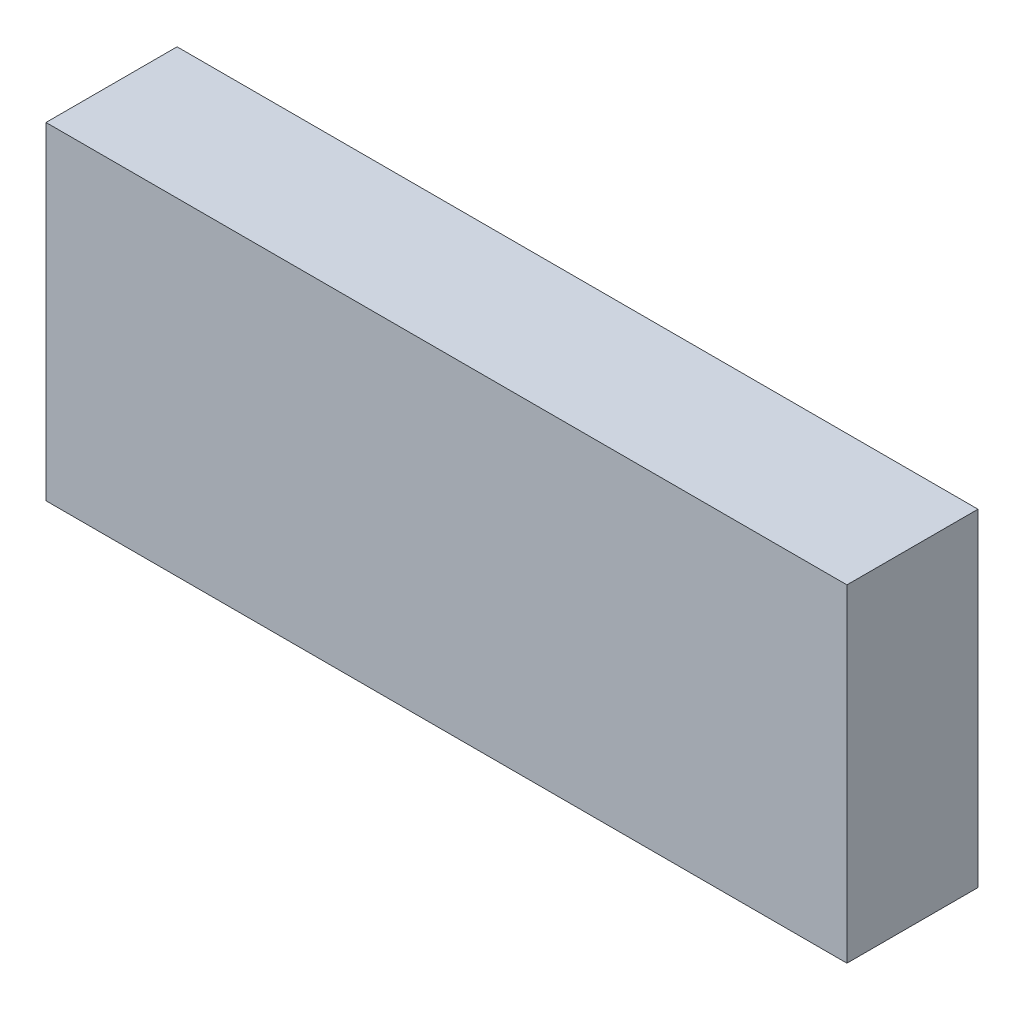
ISO-10303-21;
HEADER;
FILE_DESCRIPTION(('STEP AP214'),'2;1');
FILE_NAME('part.step','',(''),(''),'','','');
FILE_SCHEMA(('AUTOMOTIVE_DESIGN { 1 0 10303 214 1 1 1 1 }'));
ENDSEC;
DATA;
#1=APPLICATION_CONTEXT('core data for automotive mechanical design processes');
#2=APPLICATION_PROTOCOL_DEFINITION('international standard','automotive_design',2000,#1);
#3=PRODUCT_CONTEXT('',#1,'mechanical');
#4=PRODUCT('Part','Part','',(#3));
#5=PRODUCT_RELATED_PRODUCT_CATEGORY('part','',(#4));
#6=PRODUCT_DEFINITION_FORMATION('','',#4);
#7=PRODUCT_DEFINITION_CONTEXT('part definition',#1,'design');
#8=PRODUCT_DEFINITION('design','',#6,#7);
#9=PRODUCT_DEFINITION_SHAPE('','',#8);
#10=(LENGTH_UNIT() NAMED_UNIT(*) SI_UNIT(.MILLI.,.METRE.));
#11=(NAMED_UNIT(*) PLANE_ANGLE_UNIT() SI_UNIT($,.RADIAN.));
#12=(NAMED_UNIT(*) SI_UNIT($,.STERADIAN.) SOLID_ANGLE_UNIT());
#13=UNCERTAINTY_MEASURE_WITH_UNIT(LENGTH_MEASURE(1.E-05),#10,'distance_accuracy_value','');
#14=(GEOMETRIC_REPRESENTATION_CONTEXT(3) GLOBAL_UNCERTAINTY_ASSIGNED_CONTEXT((#13)) GLOBAL_UNIT_ASSIGNED_CONTEXT((#10,
#11,#12)) REPRESENTATION_CONTEXT('',''));
#15=CARTESIAN_POINT('',(0.,0.,0.));
#16=DIRECTION('',(0.,0.,1.));
#17=DIRECTION('',(1.,0.,0.));
#18=AXIS2_PLACEMENT_3D('',#15,#16,#17);
#19=CARTESIAN_POINT('',(-47.463556851312,15.33527696793,18.));
#20=DIRECTION('',(1.,0.,0.));
#21=DIRECTION('',(0.,1.,0.));
#22=AXIS2_PLACEMENT_3D('',#19,#20,#21);
#23=PLANE('',#22);
#24=DIRECTION('',(0.,-1.,0.));
#25=VECTOR('',#24,1.);
#26=CARTESIAN_POINT('',(-47.463556851312,15.33527696793,0.));
#27=LINE('',#26,#25);
#28=CARTESIAN_POINT('',(-47.463556851312,15.33527696793,0.));
#29=VERTEX_POINT('',#28);
#30=CARTESIAN_POINT('',(-47.463556851312,-29.66472303207,0.));
#31=VERTEX_POINT('',#30);
#32=EDGE_CURVE('E96',#29,#31,#27,.T.);
#33=ORIENTED_EDGE('',*,*,#32,.T.);
#34=DIRECTION('',(0.,0.,-1.));
#35=VECTOR('',#34,1.);
#36=CARTESIAN_POINT('',(-47.463556851312,-29.66472303207,18.));
#37=LINE('',#36,#35);
#38=CARTESIAN_POINT('',(-47.463556851312,-29.66472303207,18.));
#39=VERTEX_POINT('',#38);
#40=EDGE_CURVE('E11',#39,#31,#37,.T.);
#41=ORIENTED_EDGE('',*,*,#40,.F.);
#42=DIRECTION('',(0.,-1.,0.));
#43=VECTOR('',#42,1.);
#44=CARTESIAN_POINT('',(-47.463556851312,15.33527696793,18.));
#45=LINE('',#44,#43);
#46=CARTESIAN_POINT('',(-47.463556851312,15.33527696793,18.));
#47=VERTEX_POINT('',#46);
#48=EDGE_CURVE('E84',#47,#39,#45,.T.);
#49=ORIENTED_EDGE('',*,*,#48,.F.);
#50=DIRECTION('',(0.,0.,-1.));
#51=VECTOR('',#50,1.);
#52=CARTESIAN_POINT('',(-47.463556851312,15.33527696793,18.));
#53=LINE('',#52,#51);
#54=EDGE_CURVE('E92',#47,#29,#53,.T.);
#55=ORIENTED_EDGE('',*,*,#54,.T.);
#56=EDGE_LOOP('',(#33,#41,#49,#55));
#57=FACE_BOUND('',#56,.T.);
#58=ADVANCED_FACE('F33',(#57),#23,.F.);
#59=CARTESIAN_POINT('',(-47.463556851312,-29.66472303207,18.));
#60=DIRECTION('',(0.,1.,0.));
#61=DIRECTION('',(0.,0.,1.));
#62=AXIS2_PLACEMENT_3D('',#59,#60,#61);
#63=PLANE('',#62);
#64=DIRECTION('',(1.,0.,0.));
#65=VECTOR('',#64,1.);
#66=CARTESIAN_POINT('',(-47.463556851312,-29.66472303207,0.));
#67=LINE('',#66,#65);
#68=CARTESIAN_POINT('',(62.536443148688,-29.66472303207,0.));
#69=VERTEX_POINT('',#68);
#70=EDGE_CURVE('E88',#31,#69,#67,.T.);
#71=ORIENTED_EDGE('',*,*,#70,.T.);
#72=DIRECTION('',(0.,0.,-1.));
#73=VECTOR('',#72,1.);
#74=CARTESIAN_POINT('',(62.536443148688,-29.66472303207,18.));
#75=LINE('',#74,#73);
#76=CARTESIAN_POINT('',(62.536443148688,-29.66472303207,18.));
#77=VERTEX_POINT('',#76);
#78=EDGE_CURVE('E41',#77,#69,#75,.T.);
#79=ORIENTED_EDGE('',*,*,#78,.F.);
#80=DIRECTION('',(1.,0.,0.));
#81=VECTOR('',#80,1.);
#82=CARTESIAN_POINT('',(-47.463556851312,-29.66472303207,18.));
#83=LINE('',#82,#81);
#84=EDGE_CURVE('E79',#39,#77,#83,.T.);
#85=ORIENTED_EDGE('',*,*,#84,.F.);
#86=ORIENTED_EDGE('',*,*,#40,.T.);
#87=EDGE_LOOP('',(#71,#79,#85,#86));
#88=FACE_BOUND('',#87,.T.);
#89=ADVANCED_FACE('F87',(#88),#63,.F.);
#90=CARTESIAN_POINT('',(62.536443148688,15.33527696793,18.));
#91=DIRECTION('',(-1.,0.,0.));
#92=DIRECTION('',(0.,0.,1.));
#93=AXIS2_PLACEMENT_3D('',#90,#91,#92);
#94=PLANE('',#93);
#95=DIRECTION('',(0.,1.,0.));
#96=VECTOR('',#95,1.);
#97=CARTESIAN_POINT('',(62.536443148688,15.33527696793,0.));
#98=LINE('',#97,#96);
#99=CARTESIAN_POINT('',(62.536443148688,15.33527696793,0.));
#100=VERTEX_POINT('',#99);
#101=EDGE_CURVE('E66',#69,#100,#98,.T.);
#102=ORIENTED_EDGE('',*,*,#101,.T.);
#103=DIRECTION('',(0.,0.,-1.));
#104=VECTOR('',#103,1.);
#105=CARTESIAN_POINT('',(62.536443148688,15.33527696793,18.));
#106=LINE('',#105,#104);
#107=CARTESIAN_POINT('',(62.536443148688,15.33527696793,18.));
#108=VERTEX_POINT('',#107);
#109=EDGE_CURVE('E89',#108,#100,#106,.T.);
#110=ORIENTED_EDGE('',*,*,#109,.F.);
#111=DIRECTION('',(0.,1.,0.));
#112=VECTOR('',#111,1.);
#113=CARTESIAN_POINT('',(62.536443148688,15.33527696793,18.));
#114=LINE('',#113,#112);
#115=EDGE_CURVE('E82',#77,#108,#114,.T.);
#116=ORIENTED_EDGE('',*,*,#115,.F.);
#117=ORIENTED_EDGE('',*,*,#78,.T.);
#118=EDGE_LOOP('',(#102,#110,#116,#117));
#119=FACE_BOUND('',#118,.T.);
#120=ADVANCED_FACE('F90',(#119),#94,.F.);
#121=CARTESIAN_POINT('',(-47.463556851312,15.33527696793,18.));
#122=DIRECTION('',(0.,-1.,0.));
#123=DIRECTION('',(0.,0.,-1.));
#124=AXIS2_PLACEMENT_3D('',#121,#122,#123);
#125=PLANE('',#124);
#126=DIRECTION('',(-1.,0.,0.));
#127=VECTOR('',#126,1.);
#128=CARTESIAN_POINT('',(-47.463556851312,15.33527696793,0.));
#129=LINE('',#128,#127);
#130=EDGE_CURVE('E72',#100,#29,#129,.T.);
#131=ORIENTED_EDGE('',*,*,#130,.T.);
#132=ORIENTED_EDGE('',*,*,#54,.F.);
#133=DIRECTION('',(-1.,0.,0.));
#134=VECTOR('',#133,1.);
#135=CARTESIAN_POINT('',(-47.463556851312,15.33527696793,18.));
#136=LINE('',#135,#134);
#137=EDGE_CURVE('E49',#108,#47,#136,.T.);
#138=ORIENTED_EDGE('',*,*,#137,.F.);
#139=ORIENTED_EDGE('',*,*,#109,.T.);
#140=EDGE_LOOP('',(#131,#132,#138,#139));
#141=FACE_BOUND('',#140,.T.);
#142=ADVANCED_FACE('F103',(#141),#125,.F.);
#143=CARTESIAN_POINT('',(0.,0.,18.));
#144=DIRECTION('',(0.,0.,1.));
#145=DIRECTION('',(1.,0.,0.));
#146=AXIS2_PLACEMENT_3D('',#143,#144,#145);
#147=PLANE('',#146);
#148=ORIENTED_EDGE('',*,*,#48,.T.);
#149=ORIENTED_EDGE('',*,*,#84,.T.);
#150=ORIENTED_EDGE('',*,*,#115,.T.);
#151=ORIENTED_EDGE('',*,*,#137,.T.);
#152=EDGE_LOOP('',(#148,#149,#150,#151));
#153=FACE_BOUND('',#152,.T.);
#154=ADVANCED_FACE('F80',(#153),#147,.T.);
#155=CARTESIAN_POINT('',(0.,0.,0.));
#156=DIRECTION('',(0.,0.,1.));
#157=DIRECTION('',(1.,0.,0.));
#158=AXIS2_PLACEMENT_3D('',#155,#156,#157);
#159=PLANE('',#158);
#160=ORIENTED_EDGE('',*,*,#32,.F.);
#161=ORIENTED_EDGE('',*,*,#130,.F.);
#162=ORIENTED_EDGE('',*,*,#101,.F.);
#163=ORIENTED_EDGE('',*,*,#70,.F.);
#164=EDGE_LOOP('',(#160,#161,#162,#163));
#165=FACE_BOUND('',#164,.T.);
#166=ADVANCED_FACE('F106',(#165),#159,.F.);
#167=CLOSED_SHELL('',(#58,#89,#120,#142,#154,#166));
#168=MANIFOLD_SOLID_BREP('B2',#167);
#169=ADVANCED_BREP_SHAPE_REPRESENTATION('',(#18,#168),#14);
#170=SHAPE_DEFINITION_REPRESENTATION(#9,#169);
ENDSEC;
END-ISO-10303-21;
